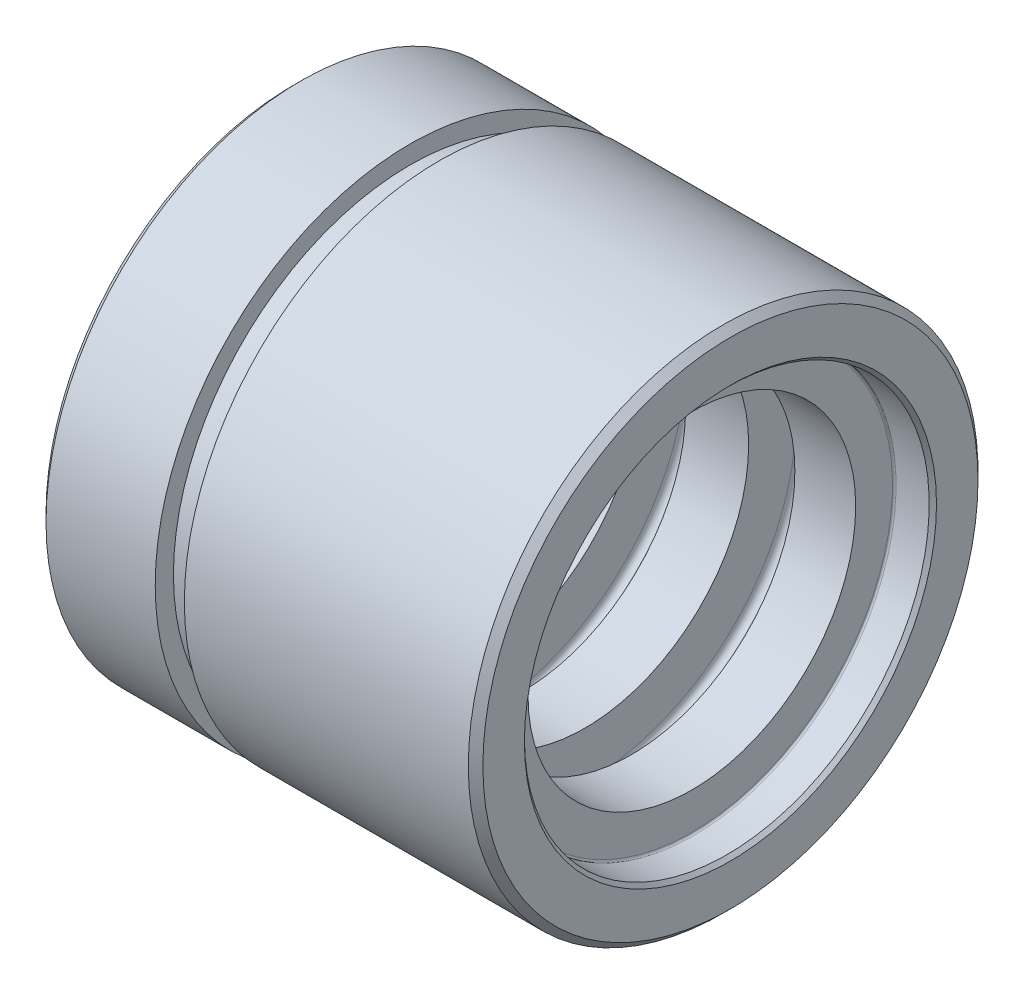
ISO-10303-21;
HEADER;
FILE_DESCRIPTION(('STEP AP214'),'2;1');
FILE_NAME('part.step','',(''),(''),'','','');
FILE_SCHEMA(('AUTOMOTIVE_DESIGN { 1 0 10303 214 1 1 1 1 }'));
ENDSEC;
DATA;
#1=APPLICATION_CONTEXT('core data for automotive mechanical design processes');
#2=APPLICATION_PROTOCOL_DEFINITION('international standard','automotive_design',2000,#1);
#3=PRODUCT_CONTEXT('',#1,'mechanical');
#4=PRODUCT('Part','Part','',(#3));
#5=PRODUCT_RELATED_PRODUCT_CATEGORY('part','',(#4));
#6=PRODUCT_DEFINITION_FORMATION('','',#4);
#7=PRODUCT_DEFINITION_CONTEXT('part definition',#1,'design');
#8=PRODUCT_DEFINITION('design','',#6,#7);
#9=PRODUCT_DEFINITION_SHAPE('','',#8);
#10=(LENGTH_UNIT() NAMED_UNIT(*) SI_UNIT(.MILLI.,.METRE.));
#11=(NAMED_UNIT(*) PLANE_ANGLE_UNIT() SI_UNIT($,.RADIAN.));
#12=(NAMED_UNIT(*) SI_UNIT($,.STERADIAN.) SOLID_ANGLE_UNIT());
#13=UNCERTAINTY_MEASURE_WITH_UNIT(LENGTH_MEASURE(1.E-05),#10,'distance_accuracy_value','');
#14=(GEOMETRIC_REPRESENTATION_CONTEXT(3) GLOBAL_UNCERTAINTY_ASSIGNED_CONTEXT((#13)) GLOBAL_UNIT_ASSIGNED_CONTEXT((#10,
#11,#12)) REPRESENTATION_CONTEXT('',''));
#15=CARTESIAN_POINT('',(0.,0.,0.));
#16=DIRECTION('',(0.,0.,1.));
#17=DIRECTION('',(1.,0.,0.));
#18=AXIS2_PLACEMENT_3D('',#15,#16,#17);
#19=CARTESIAN_POINT('',(0.,0.,-34.));
#20=DIRECTION('',(1.,0.,0.));
#21=DIRECTION('',(0.,0.,-1.));
#22=AXIS2_PLACEMENT_3D('',#19,#20,#21);
#23=PLANE('',#22);
#24=CARTESIAN_POINT('',(0.,0.,0.));
#25=DIRECTION('',(-1.,0.,0.));
#26=DIRECTION('',(0.,0.,1.));
#27=AXIS2_PLACEMENT_3D('',#24,#25,#26);
#28=CIRCLE('',#27,22.5);
#29=CARTESIAN_POINT('',(0.,0.,22.5));
#30=VERTEX_POINT('',#29);
#31=EDGE_CURVE('E88',#30,#30,#28,.T.);
#32=ORIENTED_EDGE('',*,*,#31,.F.);
#33=EDGE_LOOP('',(#32));
#34=FACE_BOUND('',#33,.T.);
#35=CARTESIAN_POINT('',(0.,0.,0.));
#36=DIRECTION('',(-1.,0.,0.));
#37=DIRECTION('',(0.,0.,1.));
#38=AXIS2_PLACEMENT_3D('',#35,#36,#37);
#39=CIRCLE('',#38,34.);
#40=CARTESIAN_POINT('',(0.,0.,34.));
#41=VERTEX_POINT('',#40);
#42=EDGE_CURVE('E127',#41,#41,#39,.T.);
#43=ORIENTED_EDGE('',*,*,#42,.T.);
#44=EDGE_LOOP('',(#43));
#45=FACE_BOUND('',#44,.T.);
#46=ADVANCED_FACE('F44',(#34,#45),#23,.F.);
#47=CARTESIAN_POINT('',(-2.23979383310828,0.,0.));
#48=DIRECTION('',(-1.,0.,0.));
#49=DIRECTION('',(0.,0.,1.));
#50=AXIS2_PLACEMENT_3D('',#47,#48,#49);
#51=CYLINDRICAL_SURFACE('',#50,22.5);
#52=CARTESIAN_POINT('',(25.,0.,0.));
#53=DIRECTION('',(-1.,0.,0.));
#54=DIRECTION('',(0.,0.,1.));
#55=AXIS2_PLACEMENT_3D('',#52,#53,#54);
#56=CIRCLE('',#55,22.5);
#57=CARTESIAN_POINT('',(25.,0.,22.5));
#58=VERTEX_POINT('',#57);
#59=EDGE_CURVE('E91',#58,#58,#56,.T.);
#60=ORIENTED_EDGE('',*,*,#59,.F.);
#61=EDGE_LOOP('',(#60));
#62=FACE_BOUND('',#61,.T.);
#63=ORIENTED_EDGE('',*,*,#31,.T.);
#64=EDGE_LOOP('',(#63));
#65=FACE_BOUND('',#64,.T.);
#66=ADVANCED_FACE('F187',(#62,#65),#51,.F.);
#67=CARTESIAN_POINT('',(25.,0.,-22.5));
#68=DIRECTION('',(-1.,0.,0.));
#69=DIRECTION('',(0.,0.,1.));
#70=AXIS2_PLACEMENT_3D('',#67,#68,#69);
#71=PLANE('',#70);
#72=CARTESIAN_POINT('',(25.,0.,0.));
#73=DIRECTION('',(-1.,0.,0.));
#74=DIRECTION('',(0.,0.,1.));
#75=AXIS2_PLACEMENT_3D('',#72,#73,#74);
#76=CIRCLE('',#75,29.);
#77=CARTESIAN_POINT('',(25.,0.,29.));
#78=VERTEX_POINT('',#77);
#79=EDGE_CURVE('E79',#78,#78,#76,.F.);
#80=ORIENTED_EDGE('',*,*,#79,.T.);
#81=EDGE_LOOP('',(#80));
#82=FACE_BOUND('',#81,.T.);
#83=ORIENTED_EDGE('',*,*,#59,.T.);
#84=EDGE_LOOP('',(#83));
#85=FACE_BOUND('',#84,.T.);
#86=ADVANCED_FACE('F193',(#82,#85),#71,.F.);
#87=CARTESIAN_POINT('',(-2.23979383310828,0.,0.));
#88=DIRECTION('',(-1.,0.,0.));
#89=DIRECTION('',(0.,0.,1.));
#90=AXIS2_PLACEMENT_3D('',#87,#88,#89);
#91=CYLINDRICAL_SURFACE('',#90,30.);
#92=CARTESIAN_POINT('',(26.,0.,0.));
#93=DIRECTION('',(-1.,0.,0.));
#94=DIRECTION('',(0.,0.,1.));
#95=AXIS2_PLACEMENT_3D('',#92,#93,#94);
#96=CIRCLE('',#95,30.);
#97=CARTESIAN_POINT('',(26.,0.,30.));
#98=VERTEX_POINT('',#97);
#99=EDGE_CURVE('E82',#98,#98,#96,.T.);
#100=ORIENTED_EDGE('',*,*,#99,.T.);
#101=EDGE_LOOP('',(#100));
#102=FACE_BOUND('',#101,.T.);
#103=CARTESIAN_POINT('',(30.35,0.,0.));
#104=DIRECTION('',(1.,0.,0.));
#105=DIRECTION('',(0.,0.,-1.));
#106=AXIS2_PLACEMENT_3D('',#103,#104,#105);
#107=CIRCLE('',#106,30.);
#108=CARTESIAN_POINT('',(30.35,0.,-30.));
#109=VERTEX_POINT('',#108);
#110=EDGE_CURVE('E85',#109,#109,#107,.T.);
#111=ORIENTED_EDGE('',*,*,#110,.T.);
#112=EDGE_LOOP('',(#111));
#113=FACE_BOUND('',#112,.T.);
#114=ADVANCED_FACE('F329',(#102,#113),#91,.F.);
#115=CARTESIAN_POINT('',(31.35,0.,-30.));
#116=DIRECTION('',(1.,0.,0.));
#117=DIRECTION('',(0.,0.,-1.));
#118=AXIS2_PLACEMENT_3D('',#115,#116,#117);
#119=PLANE('',#118);
#120=CARTESIAN_POINT('',(31.35,0.,0.));
#121=DIRECTION('',(1.,0.,0.));
#122=DIRECTION('',(0.,0.,-1.));
#123=AXIS2_PLACEMENT_3D('',#120,#121,#122);
#124=CIRCLE('',#123,29.);
#125=CARTESIAN_POINT('',(31.35,0.,-29.));
#126=VERTEX_POINT('',#125);
#127=EDGE_CURVE('E76',#126,#126,#124,.F.);
#128=ORIENTED_EDGE('',*,*,#127,.T.);
#129=EDGE_LOOP('',(#128));
#130=FACE_BOUND('',#129,.T.);
#131=CARTESIAN_POINT('',(31.35,0.,0.));
#132=DIRECTION('',(-1.,0.,0.));
#133=DIRECTION('',(0.,0.,1.));
#134=AXIS2_PLACEMENT_3D('',#131,#132,#133);
#135=CIRCLE('',#134,22.5);
#136=CARTESIAN_POINT('',(31.35,0.,22.5));
#137=VERTEX_POINT('',#136);
#138=EDGE_CURVE('E94',#137,#137,#135,.T.);
#139=ORIENTED_EDGE('',*,*,#138,.F.);
#140=EDGE_LOOP('',(#139));
#141=FACE_BOUND('',#140,.T.);
#142=ADVANCED_FACE('F324',(#130,#141),#119,.F.);
#143=CARTESIAN_POINT('',(-2.23979383310828,0.,0.));
#144=DIRECTION('',(-1.,0.,0.));
#145=DIRECTION('',(0.,0.,1.));
#146=AXIS2_PLACEMENT_3D('',#143,#144,#145);
#147=CYLINDRICAL_SURFACE('',#146,22.5);
#148=CARTESIAN_POINT('',(40.,0.,0.));
#149=DIRECTION('',(-1.,0.,0.));
#150=DIRECTION('',(0.,0.,1.));
#151=AXIS2_PLACEMENT_3D('',#148,#149,#150);
#152=CIRCLE('',#151,22.5);
#153=CARTESIAN_POINT('',(40.,0.,22.5));
#154=VERTEX_POINT('',#153);
#155=EDGE_CURVE('E97',#154,#154,#152,.T.);
#156=ORIENTED_EDGE('',*,*,#155,.F.);
#157=EDGE_LOOP('',(#156));
#158=FACE_BOUND('',#157,.T.);
#159=ORIENTED_EDGE('',*,*,#138,.T.);
#160=EDGE_LOOP('',(#159));
#161=FACE_BOUND('',#160,.T.);
#162=ADVANCED_FACE('F315',(#158,#161),#147,.F.);
#163=CARTESIAN_POINT('',(40.,0.,-22.5));
#164=DIRECTION('',(-1.,0.,0.));
#165=DIRECTION('',(0.,0.,1.));
#166=AXIS2_PLACEMENT_3D('',#163,#164,#165);
#167=PLANE('',#166);
#168=CARTESIAN_POINT('',(40.,0.,0.));
#169=DIRECTION('',(-1.,0.,0.));
#170=DIRECTION('',(0.,0.,1.));
#171=AXIS2_PLACEMENT_3D('',#168,#169,#170);
#172=CIRCLE('',#171,29.);
#173=CARTESIAN_POINT('',(40.,0.,29.));
#174=VERTEX_POINT('',#173);
#175=EDGE_CURVE('E67',#174,#174,#172,.F.);
#176=ORIENTED_EDGE('',*,*,#175,.T.);
#177=EDGE_LOOP('',(#176));
#178=FACE_BOUND('',#177,.T.);
#179=ORIENTED_EDGE('',*,*,#155,.T.);
#180=EDGE_LOOP('',(#179));
#181=FACE_BOUND('',#180,.T.);
#182=ADVANCED_FACE('F304',(#178,#181),#167,.F.);
#183=CARTESIAN_POINT('',(-2.23979383310828,0.,0.));
#184=DIRECTION('',(-1.,0.,0.));
#185=DIRECTION('',(0.,0.,1.));
#186=AXIS2_PLACEMENT_3D('',#183,#184,#185);
#187=CYLINDRICAL_SURFACE('',#186,30.);
#188=CARTESIAN_POINT('',(41.,0.,0.));
#189=DIRECTION('',(-1.,0.,0.));
#190=DIRECTION('',(0.,0.,1.));
#191=AXIS2_PLACEMENT_3D('',#188,#189,#190);
#192=CIRCLE('',#191,30.);
#193=CARTESIAN_POINT('',(41.,0.,30.));
#194=VERTEX_POINT('',#193);
#195=EDGE_CURVE('E70',#194,#194,#192,.T.);
#196=ORIENTED_EDGE('',*,*,#195,.T.);
#197=EDGE_LOOP('',(#196));
#198=FACE_BOUND('',#197,.T.);
#199=CARTESIAN_POINT('',(45.35,0.,0.));
#200=DIRECTION('',(1.,0.,0.));
#201=DIRECTION('',(0.,0.,-1.));
#202=AXIS2_PLACEMENT_3D('',#199,#200,#201);
#203=CIRCLE('',#202,30.);
#204=CARTESIAN_POINT('',(45.35,0.,-30.));
#205=VERTEX_POINT('',#204);
#206=EDGE_CURVE('E73',#205,#205,#203,.T.);
#207=ORIENTED_EDGE('',*,*,#206,.T.);
#208=EDGE_LOOP('',(#207));
#209=FACE_BOUND('',#208,.T.);
#210=ADVANCED_FACE('F292',(#198,#209),#187,.F.);
#211=CARTESIAN_POINT('',(46.35,0.,-30.));
#212=DIRECTION('',(1.,0.,0.));
#213=DIRECTION('',(0.,0.,-1.));
#214=AXIS2_PLACEMENT_3D('',#211,#212,#213);
#215=PLANE('',#214);
#216=CARTESIAN_POINT('',(46.35,0.,0.));
#217=DIRECTION('',(1.,0.,0.));
#218=DIRECTION('',(0.,0.,-1.));
#219=AXIS2_PLACEMENT_3D('',#216,#217,#218);
#220=CIRCLE('',#219,29.);
#221=CARTESIAN_POINT('',(46.35,0.,-29.));
#222=VERTEX_POINT('',#221);
#223=EDGE_CURVE('E64',#222,#222,#220,.F.);
#224=ORIENTED_EDGE('',*,*,#223,.T.);
#225=EDGE_LOOP('',(#224));
#226=FACE_BOUND('',#225,.T.);
#227=CARTESIAN_POINT('',(46.35,0.,0.));
#228=DIRECTION('',(-1.,0.,0.));
#229=DIRECTION('',(0.,0.,1.));
#230=AXIS2_PLACEMENT_3D('',#227,#228,#229);
#231=CIRCLE('',#230,22.5);
#232=CARTESIAN_POINT('',(46.35,0.,22.5));
#233=VERTEX_POINT('',#232);
#234=EDGE_CURVE('E100',#233,#233,#231,.T.);
#235=ORIENTED_EDGE('',*,*,#234,.F.);
#236=EDGE_LOOP('',(#235));
#237=FACE_BOUND('',#236,.T.);
#238=ADVANCED_FACE('F287',(#226,#237),#215,.F.);
#239=CARTESIAN_POINT('',(-2.23979383310828,0.,0.));
#240=DIRECTION('',(-1.,0.,0.));
#241=DIRECTION('',(0.,0.,1.));
#242=AXIS2_PLACEMENT_3D('',#239,#240,#241);
#243=CYLINDRICAL_SURFACE('',#242,22.5);
#244=CARTESIAN_POINT('',(54.7,0.,0.));
#245=DIRECTION('',(-1.,0.,0.));
#246=DIRECTION('',(0.,0.,1.));
#247=AXIS2_PLACEMENT_3D('',#244,#245,#246);
#248=CIRCLE('',#247,22.5);
#249=CARTESIAN_POINT('',(54.7,0.,22.5));
#250=VERTEX_POINT('',#249);
#251=EDGE_CURVE('E103',#250,#250,#248,.T.);
#252=ORIENTED_EDGE('',*,*,#251,.F.);
#253=EDGE_LOOP('',(#252));
#254=FACE_BOUND('',#253,.T.);
#255=ORIENTED_EDGE('',*,*,#234,.T.);
#256=EDGE_LOOP('',(#255));
#257=FACE_BOUND('',#256,.T.);
#258=ADVANCED_FACE('F242',(#254,#257),#243,.F.);
#259=CARTESIAN_POINT('',(54.7,0.,-22.5));
#260=DIRECTION('',(-1.,0.,0.));
#261=DIRECTION('',(0.,0.,1.));
#262=AXIS2_PLACEMENT_3D('',#259,#260,#261);
#263=PLANE('',#262);
#264=CARTESIAN_POINT('',(54.7,0.,0.));
#265=DIRECTION('',(-1.,0.,0.));
#266=DIRECTION('',(0.,0.,1.));
#267=AXIS2_PLACEMENT_3D('',#264,#265,#266);
#268=CIRCLE('',#267,27.55);
#269=CARTESIAN_POINT('',(54.7,0.,27.55));
#270=VERTEX_POINT('',#269);
#271=EDGE_CURVE('E10',#270,#270,#268,.F.);
#272=ORIENTED_EDGE('',*,*,#271,.T.);
#273=EDGE_LOOP('',(#272));
#274=FACE_BOUND('',#273,.T.);
#275=ORIENTED_EDGE('',*,*,#251,.T.);
#276=EDGE_LOOP('',(#275));
#277=FACE_BOUND('',#276,.T.);
#278=ADVANCED_FACE('F184',(#274,#277),#263,.F.);
#279=CARTESIAN_POINT('',(-2.23979383310828,0.,0.));
#280=DIRECTION('',(-1.,0.,0.));
#281=DIRECTION('',(0.,0.,1.));
#282=AXIS2_PLACEMENT_3D('',#279,#280,#281);
#283=CYLINDRICAL_SURFACE('',#282,27.8);
#284=CARTESIAN_POINT('',(54.95,0.,0.));
#285=DIRECTION('',(-1.,0.,0.));
#286=DIRECTION('',(0.,0.,1.));
#287=AXIS2_PLACEMENT_3D('',#284,#285,#286);
#288=CIRCLE('',#287,27.8);
#289=CARTESIAN_POINT('',(54.95,0.,27.8));
#290=VERTEX_POINT('',#289);
#291=EDGE_CURVE('E51',#290,#290,#288,.T.);
#292=ORIENTED_EDGE('',*,*,#291,.T.);
#293=EDGE_LOOP('',(#292));
#294=FACE_BOUND('',#293,.T.);
#295=CARTESIAN_POINT('',(59.5,0.,0.));
#296=DIRECTION('',(-1.,0.,0.));
#297=DIRECTION('',(0.,0.,1.));
#298=AXIS2_PLACEMENT_3D('',#295,#296,#297);
#299=CIRCLE('',#298,27.8);
#300=CARTESIAN_POINT('',(59.5,0.,27.8));
#301=VERTEX_POINT('',#300);
#302=EDGE_CURVE('E55',#301,#301,#299,.F.);
#303=ORIENTED_EDGE('',*,*,#302,.T.);
#304=EDGE_LOOP('',(#303));
#305=FACE_BOUND('',#304,.T.);
#306=ADVANCED_FACE('F177',(#294,#305),#283,.F.);
#307=CARTESIAN_POINT('',(60.,0.,-27.8));
#308=DIRECTION('',(-1.,0.,0.));
#309=DIRECTION('',(0.,0.,1.));
#310=AXIS2_PLACEMENT_3D('',#307,#308,#309);
#311=PLANE('',#310);
#312=CARTESIAN_POINT('',(60.,0.,0.));
#313=DIRECTION('',(-1.,0.,0.));
#314=DIRECTION('',(0.,0.,1.));
#315=AXIS2_PLACEMENT_3D('',#312,#313,#314);
#316=CIRCLE('',#315,28.3);
#317=CARTESIAN_POINT('',(60.,0.,28.3));
#318=VERTEX_POINT('',#317);
#319=EDGE_CURVE('E59',#318,#318,#316,.T.);
#320=ORIENTED_EDGE('',*,*,#319,.T.);
#321=EDGE_LOOP('',(#320));
#322=FACE_BOUND('',#321,.T.);
#323=CARTESIAN_POINT('',(60.,0.,0.));
#324=DIRECTION('',(-1.,0.,0.));
#325=DIRECTION('',(0.,0.,1.));
#326=AXIS2_PLACEMENT_3D('',#323,#324,#325);
#327=CIRCLE('',#326,34.);
#328=CARTESIAN_POINT('',(60.,0.,34.));
#329=VERTEX_POINT('',#328);
#330=EDGE_CURVE('E106',#329,#329,#327,.T.);
#331=ORIENTED_EDGE('',*,*,#330,.F.);
#332=EDGE_LOOP('',(#331));
#333=FACE_BOUND('',#332,.T.);
#334=ADVANCED_FACE('F172',(#322,#333),#311,.F.);
#335=CARTESIAN_POINT('',(60.,0.,0.));
#336=DIRECTION('',(-1.,0.,0.));
#337=DIRECTION('',(0.,0.,1.));
#338=AXIS2_PLACEMENT_3D('',#335,#336,#337);
#339=CONICAL_SURFACE('',#338,34.,0.785398163397448);
#340=CARTESIAN_POINT('',(59.,0.,0.));
#341=DIRECTION('',(-1.,0.,0.));
#342=DIRECTION('',(0.,0.,1.));
#343=AXIS2_PLACEMENT_3D('',#340,#341,#342);
#344=CIRCLE('',#343,35.);
#345=CARTESIAN_POINT('',(59.,0.,35.));
#346=VERTEX_POINT('',#345);
#347=EDGE_CURVE('E109',#346,#346,#344,.T.);
#348=ORIENTED_EDGE('',*,*,#347,.F.);
#349=EDGE_LOOP('',(#348));
#350=FACE_BOUND('',#349,.T.);
#351=ORIENTED_EDGE('',*,*,#330,.T.);
#352=EDGE_LOOP('',(#351));
#353=FACE_BOUND('',#352,.T.);
#354=ADVANCED_FACE('F166',(#350,#353),#339,.T.);
#355=CARTESIAN_POINT('',(-2.23979383310828,0.,0.));
#356=DIRECTION('',(-1.,0.,0.));
#357=DIRECTION('',(0.,0.,1.));
#358=AXIS2_PLACEMENT_3D('',#355,#356,#357);
#359=CYLINDRICAL_SURFACE('',#358,35.);
#360=CARTESIAN_POINT('',(20.,0.,0.));
#361=DIRECTION('',(-1.,0.,0.));
#362=DIRECTION('',(0.,0.,1.));
#363=AXIS2_PLACEMENT_3D('',#360,#361,#362);
#364=CIRCLE('',#363,35.);
#365=CARTESIAN_POINT('',(20.,0.,35.));
#366=VERTEX_POINT('',#365);
#367=EDGE_CURVE('E112',#366,#366,#364,.T.);
#368=ORIENTED_EDGE('',*,*,#367,.F.);
#369=EDGE_LOOP('',(#368));
#370=FACE_BOUND('',#369,.T.);
#371=ORIENTED_EDGE('',*,*,#347,.T.);
#372=EDGE_LOOP('',(#371));
#373=FACE_BOUND('',#372,.T.);
#374=ADVANCED_FACE('F160',(#370,#373),#359,.T.);
#375=CARTESIAN_POINT('',(20.,0.,-35.));
#376=DIRECTION('',(1.,0.,0.));
#377=DIRECTION('',(0.,0.,-1.));
#378=AXIS2_PLACEMENT_3D('',#375,#376,#377);
#379=PLANE('',#378);
#380=CARTESIAN_POINT('',(20.,0.,0.));
#381=DIRECTION('',(-1.,0.,0.));
#382=DIRECTION('',(0.,0.,1.));
#383=AXIS2_PLACEMENT_3D('',#380,#381,#382);
#384=CIRCLE('',#383,32.5);
#385=CARTESIAN_POINT('',(20.,0.,32.5));
#386=VERTEX_POINT('',#385);
#387=EDGE_CURVE('E115',#386,#386,#384,.T.);
#388=ORIENTED_EDGE('',*,*,#387,.F.);
#389=EDGE_LOOP('',(#388));
#390=FACE_BOUND('',#389,.T.);
#391=ORIENTED_EDGE('',*,*,#367,.T.);
#392=EDGE_LOOP('',(#391));
#393=FACE_BOUND('',#392,.T.);
#394=ADVANCED_FACE('F154',(#390,#393),#379,.F.);
#395=CARTESIAN_POINT('',(-2.23979383310828,0.,0.));
#396=DIRECTION('',(-1.,0.,0.));
#397=DIRECTION('',(0.,0.,1.));
#398=AXIS2_PLACEMENT_3D('',#395,#396,#397);
#399=CYLINDRICAL_SURFACE('',#398,32.5);
#400=CARTESIAN_POINT('',(16.,0.,0.));
#401=DIRECTION('',(-1.,0.,0.));
#402=DIRECTION('',(0.,0.,1.));
#403=AXIS2_PLACEMENT_3D('',#400,#401,#402);
#404=CIRCLE('',#403,32.5);
#405=CARTESIAN_POINT('',(16.,0.,32.5));
#406=VERTEX_POINT('',#405);
#407=EDGE_CURVE('E118',#406,#406,#404,.T.);
#408=ORIENTED_EDGE('',*,*,#407,.F.);
#409=EDGE_LOOP('',(#408));
#410=FACE_BOUND('',#409,.T.);
#411=ORIENTED_EDGE('',*,*,#387,.T.);
#412=EDGE_LOOP('',(#411));
#413=FACE_BOUND('',#412,.T.);
#414=ADVANCED_FACE('F148',(#410,#413),#399,.T.);
#415=CARTESIAN_POINT('',(16.,0.,-32.5));
#416=DIRECTION('',(-1.,0.,0.));
#417=DIRECTION('',(0.,0.,1.));
#418=AXIS2_PLACEMENT_3D('',#415,#416,#417);
#419=PLANE('',#418);
#420=CARTESIAN_POINT('',(16.,0.,0.));
#421=DIRECTION('',(-1.,0.,0.));
#422=DIRECTION('',(0.,0.,1.));
#423=AXIS2_PLACEMENT_3D('',#420,#421,#422);
#424=CIRCLE('',#423,35.);
#425=CARTESIAN_POINT('',(16.,0.,35.));
#426=VERTEX_POINT('',#425);
#427=EDGE_CURVE('E121',#426,#426,#424,.T.);
#428=ORIENTED_EDGE('',*,*,#427,.F.);
#429=EDGE_LOOP('',(#428));
#430=FACE_BOUND('',#429,.T.);
#431=ORIENTED_EDGE('',*,*,#407,.T.);
#432=EDGE_LOOP('',(#431));
#433=FACE_BOUND('',#432,.T.);
#434=ADVANCED_FACE('F142',(#430,#433),#419,.F.);
#435=CARTESIAN_POINT('',(-2.23979383310828,0.,0.));
#436=DIRECTION('',(-1.,0.,0.));
#437=DIRECTION('',(0.,0.,1.));
#438=AXIS2_PLACEMENT_3D('',#435,#436,#437);
#439=CYLINDRICAL_SURFACE('',#438,35.);
#440=CARTESIAN_POINT('',(1.,0.,0.));
#441=DIRECTION('',(-1.,0.,0.));
#442=DIRECTION('',(0.,0.,1.));
#443=AXIS2_PLACEMENT_3D('',#440,#441,#442);
#444=CIRCLE('',#443,35.);
#445=CARTESIAN_POINT('',(1.,0.,35.));
#446=VERTEX_POINT('',#445);
#447=EDGE_CURVE('E124',#446,#446,#444,.T.);
#448=ORIENTED_EDGE('',*,*,#447,.F.);
#449=EDGE_LOOP('',(#448));
#450=FACE_BOUND('',#449,.T.);
#451=ORIENTED_EDGE('',*,*,#427,.T.);
#452=EDGE_LOOP('',(#451));
#453=FACE_BOUND('',#452,.T.);
#454=ADVANCED_FACE('F136',(#450,#453),#439,.T.);
#455=CARTESIAN_POINT('',(1.,0.,0.));
#456=DIRECTION('',(1.,0.,0.));
#457=DIRECTION('',(0.,0.,-1.));
#458=AXIS2_PLACEMENT_3D('',#455,#456,#457);
#459=CONICAL_SURFACE('',#458,35.,0.785398163397449);
#460=ORIENTED_EDGE('',*,*,#42,.F.);
#461=EDGE_LOOP('',(#460));
#462=FACE_BOUND('',#461,.T.);
#463=ORIENTED_EDGE('',*,*,#447,.T.);
#464=EDGE_LOOP('',(#463));
#465=FACE_BOUND('',#464,.T.);
#466=ADVANCED_FACE('F132',(#462,#465),#459,.T.);
#467=CARTESIAN_POINT('',(26.,0.,0.));
#468=DIRECTION('',(-1.,0.,0.));
#469=DIRECTION('',(0.,0.,1.));
#470=AXIS2_PLACEMENT_3D('',#467,#468,#469);
#471=TOROIDAL_SURFACE('',#470,29.,1.);
#472=ORIENTED_EDGE('',*,*,#79,.F.);
#473=EDGE_LOOP('',(#472));
#474=FACE_BOUND('',#473,.T.);
#475=ORIENTED_EDGE('',*,*,#99,.F.);
#476=EDGE_LOOP('',(#475));
#477=FACE_BOUND('',#476,.T.);
#478=ADVANCED_FACE('F135',(#474,#477),#471,.F.);
#479=CARTESIAN_POINT('',(30.35,0.,0.));
#480=DIRECTION('',(1.,0.,0.));
#481=DIRECTION('',(0.,0.,-1.));
#482=AXIS2_PLACEMENT_3D('',#479,#480,#481);
#483=TOROIDAL_SURFACE('',#482,29.,1.);
#484=ORIENTED_EDGE('',*,*,#110,.F.);
#485=EDGE_LOOP('',(#484));
#486=FACE_BOUND('',#485,.T.);
#487=ORIENTED_EDGE('',*,*,#127,.F.);
#488=EDGE_LOOP('',(#487));
#489=FACE_BOUND('',#488,.T.);
#490=ADVANCED_FACE('F201',(#486,#489),#483,.F.);
#491=CARTESIAN_POINT('',(41.,0.,0.));
#492=DIRECTION('',(-1.,0.,0.));
#493=DIRECTION('',(0.,0.,1.));
#494=AXIS2_PLACEMENT_3D('',#491,#492,#493);
#495=TOROIDAL_SURFACE('',#494,29.,1.);
#496=ORIENTED_EDGE('',*,*,#175,.F.);
#497=EDGE_LOOP('',(#496));
#498=FACE_BOUND('',#497,.T.);
#499=ORIENTED_EDGE('',*,*,#195,.F.);
#500=EDGE_LOOP('',(#499));
#501=FACE_BOUND('',#500,.T.);
#502=ADVANCED_FACE('F205',(#498,#501),#495,.F.);
#503=CARTESIAN_POINT('',(45.35,0.,0.));
#504=DIRECTION('',(1.,0.,0.));
#505=DIRECTION('',(0.,0.,-1.));
#506=AXIS2_PLACEMENT_3D('',#503,#504,#505);
#507=TOROIDAL_SURFACE('',#506,29.,1.);
#508=ORIENTED_EDGE('',*,*,#206,.F.);
#509=EDGE_LOOP('',(#508));
#510=FACE_BOUND('',#509,.T.);
#511=ORIENTED_EDGE('',*,*,#223,.F.);
#512=EDGE_LOOP('',(#511));
#513=FACE_BOUND('',#512,.T.);
#514=ADVANCED_FACE('F209',(#510,#513),#507,.F.);
#515=CARTESIAN_POINT('',(60.,0.,0.));
#516=DIRECTION('',(1.,0.,0.));
#517=DIRECTION('',(0.,0.,-1.));
#518=AXIS2_PLACEMENT_3D('',#515,#516,#517);
#519=CONICAL_SURFACE('',#518,28.3,0.785398163397455);
#520=ORIENTED_EDGE('',*,*,#302,.F.);
#521=EDGE_LOOP('',(#520));
#522=FACE_BOUND('',#521,.T.);
#523=ORIENTED_EDGE('',*,*,#319,.F.);
#524=EDGE_LOOP('',(#523));
#525=FACE_BOUND('',#524,.T.);
#526=ADVANCED_FACE('F212',(#522,#525),#519,.F.);
#527=CARTESIAN_POINT('',(54.95,0.,0.));
#528=DIRECTION('',(-1.,0.,0.));
#529=DIRECTION('',(0.,0.,1.));
#530=AXIS2_PLACEMENT_3D('',#527,#528,#529);
#531=TOROIDAL_SURFACE('',#530,27.55,0.25);
#532=ORIENTED_EDGE('',*,*,#271,.F.);
#533=EDGE_LOOP('',(#532));
#534=FACE_BOUND('',#533,.T.);
#535=ORIENTED_EDGE('',*,*,#291,.F.);
#536=EDGE_LOOP('',(#535));
#537=FACE_BOUND('',#536,.T.);
#538=ADVANCED_FACE('F46',(#534,#537),#531,.F.);
#539=CLOSED_SHELL('',(#46,#66,#86,#114,#142,#162,#182,#210,#238,#258,#278,#306,#334,#354,#374,
#394,#414,#434,#454,#466,#478,#490,#502,#514,#526,#538));
#540=MANIFOLD_SOLID_BREP('B2',#539);
#541=ADVANCED_BREP_SHAPE_REPRESENTATION('',(#18,#540),#14);
#542=SHAPE_DEFINITION_REPRESENTATION(#9,#541);
ENDSEC;
END-ISO-10303-21;
